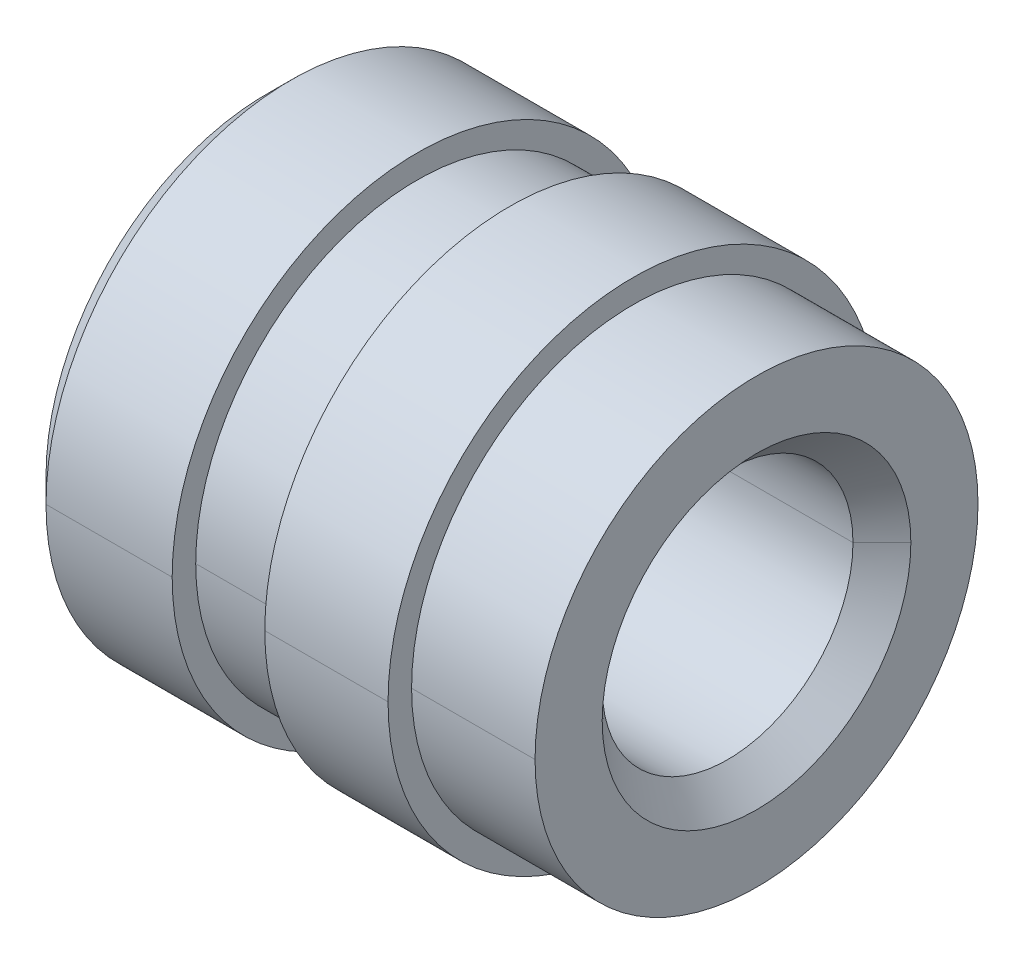
ISO-10303-21;
HEADER;
FILE_DESCRIPTION(('STEP AP214'),'2;1');
FILE_NAME('part.step','',(''),(''),'','','');
FILE_SCHEMA(('AUTOMOTIVE_DESIGN { 1 0 10303 214 1 1 1 1 }'));
ENDSEC;
DATA;
#1=APPLICATION_CONTEXT('core data for automotive mechanical design processes');
#2=APPLICATION_PROTOCOL_DEFINITION('international standard','automotive_design',2000,#1);
#3=PRODUCT_CONTEXT('',#1,'mechanical');
#4=PRODUCT('Part','Part','',(#3));
#5=PRODUCT_RELATED_PRODUCT_CATEGORY('part','',(#4));
#6=PRODUCT_DEFINITION_FORMATION('','',#4);
#7=PRODUCT_DEFINITION_CONTEXT('part definition',#1,'design');
#8=PRODUCT_DEFINITION('design','',#6,#7);
#9=PRODUCT_DEFINITION_SHAPE('','',#8);
#10=(LENGTH_UNIT() NAMED_UNIT(*) SI_UNIT(.MILLI.,.METRE.));
#11=(NAMED_UNIT(*) PLANE_ANGLE_UNIT() SI_UNIT($,.RADIAN.));
#12=(NAMED_UNIT(*) SI_UNIT($,.STERADIAN.) SOLID_ANGLE_UNIT());
#13=UNCERTAINTY_MEASURE_WITH_UNIT(LENGTH_MEASURE(1.E-05),#10,'distance_accuracy_value','');
#14=(GEOMETRIC_REPRESENTATION_CONTEXT(3) GLOBAL_UNCERTAINTY_ASSIGNED_CONTEXT((#13)) GLOBAL_UNIT_ASSIGNED_CONTEXT((#10,
#11,#12)) REPRESENTATION_CONTEXT('',''));
#15=CARTESIAN_POINT('',(0.,0.,0.));
#16=DIRECTION('',(0.,0.,1.));
#17=DIRECTION('',(1.,0.,0.));
#18=AXIS2_PLACEMENT_3D('',#15,#16,#17);
#19=CARTESIAN_POINT('',(-0.8,0.,0.));
#20=DIRECTION('',(1.,0.,0.));
#21=DIRECTION('',(0.,1.10623880200757E-13,1.));
#22=AXIS2_PLACEMENT_3D('',#19,#20,#21);
#23=CYLINDRICAL_SURFACE('',#22,2.87);
#24=DIRECTION('',(1.,0.,0.));
#25=VECTOR('',#24,1.);
#26=CARTESIAN_POINT('',(-0.8,3.17841998199719E-13,2.87));
#27=LINE('',#26,#25);
#28=CARTESIAN_POINT('',(-1.6,0.,2.87));
#29=VERTEX_POINT('',#28);
#30=CARTESIAN_POINT('',(0.,0.,2.87));
#31=VERTEX_POINT('',#30);
#32=EDGE_CURVE('E27',#29,#31,#27,.T.);
#33=ORIENTED_EDGE('',*,*,#32,.F.);
#34=CARTESIAN_POINT('',(-1.6,0.,0.));
#35=DIRECTION('',(1.,0.,0.));
#36=DIRECTION('',(0.,1.10623880200757E-13,1.));
#37=AXIS2_PLACEMENT_3D('',#34,#35,#36);
#38=CIRCLE('',#37,2.87);
#39=CARTESIAN_POINT('',(-1.6,-3.17841998199719E-13,-2.87));
#40=VERTEX_POINT('',#39);
#41=EDGE_CURVE('E259',#29,#40,#38,.T.);
#42=ORIENTED_EDGE('',*,*,#41,.T.);
#43=DIRECTION('',(-1.,0.,0.));
#44=VECTOR('',#43,1.);
#45=CARTESIAN_POINT('',(-0.8,-3.17841998199719E-13,-2.87));
#46=LINE('',#45,#44);
#47=CARTESIAN_POINT('',(0.,-3.17841998199719E-13,-2.87));
#48=VERTEX_POINT('',#47);
#49=EDGE_CURVE('E11',#48,#40,#46,.T.);
#50=ORIENTED_EDGE('',*,*,#49,.F.);
#51=CARTESIAN_POINT('',(0.,0.,0.));
#52=DIRECTION('',(1.,0.,0.));
#53=DIRECTION('',(0.,1.10623880200757E-13,1.));
#54=AXIS2_PLACEMENT_3D('',#51,#52,#53);
#55=CIRCLE('',#54,2.87);
#56=EDGE_CURVE('E215',#31,#48,#55,.T.);
#57=ORIENTED_EDGE('',*,*,#56,.F.);
#58=EDGE_LOOP('',(#33,#42,#50,#57));
#59=FACE_BOUND('',#58,.T.);
#60=ADVANCED_FACE('F16',(#59),#23,.T.);
#61=CARTESIAN_POINT('',(-0.8,0.,0.));
#62=DIRECTION('',(1.,0.,0.));
#63=DIRECTION('',(0.,1.10623880200757E-13,1.));
#64=AXIS2_PLACEMENT_3D('',#61,#62,#63);
#65=CYLINDRICAL_SURFACE('',#64,2.87);
#66=ORIENTED_EDGE('',*,*,#32,.T.);
#67=CARTESIAN_POINT('',(0.,0.,0.));
#68=DIRECTION('',(1.,0.,0.));
#69=DIRECTION('',(0.,1.10623880200757E-13,1.));
#70=AXIS2_PLACEMENT_3D('',#67,#68,#69);
#71=CIRCLE('',#70,2.87);
#72=EDGE_CURVE('E263',#48,#31,#71,.T.);
#73=ORIENTED_EDGE('',*,*,#72,.F.);
#74=ORIENTED_EDGE('',*,*,#49,.T.);
#75=CARTESIAN_POINT('',(-1.6,0.,0.));
#76=DIRECTION('',(1.,0.,0.));
#77=DIRECTION('',(0.,1.10623880200757E-13,1.));
#78=AXIS2_PLACEMENT_3D('',#75,#76,#77);
#79=CIRCLE('',#78,2.87);
#80=EDGE_CURVE('E258',#40,#29,#79,.T.);
#81=ORIENTED_EDGE('',*,*,#80,.T.);
#82=EDGE_LOOP('',(#66,#73,#74,#81));
#83=FACE_BOUND('',#82,.T.);
#84=ADVANCED_FACE('F637',(#83),#65,.T.);
#85=CARTESIAN_POINT('',(-1.6,0.,3.0225));
#86=DIRECTION('',(1.,0.,0.));
#87=DIRECTION('',(0.,0.,1.));
#88=AXIS2_PLACEMENT_3D('',#85,#86,#87);
#89=PLANE('',#88);
#90=CARTESIAN_POINT('',(-1.6,0.,0.));
#91=DIRECTION('',(1.,0.,0.));
#92=DIRECTION('',(0.,1.10623880200757E-13,1.));
#93=AXIS2_PLACEMENT_3D('',#90,#91,#92);
#94=CIRCLE('',#93,3.175);
#95=CARTESIAN_POINT('',(-1.6,0.,3.175));
#96=VERTEX_POINT('',#95);
#97=CARTESIAN_POINT('',(-1.6,-3.51619632154741E-13,-3.175));
#98=VERTEX_POINT('',#97);
#99=EDGE_CURVE('E212',#96,#98,#94,.T.);
#100=ORIENTED_EDGE('',*,*,#99,.T.);
#101=CARTESIAN_POINT('',(-1.6,0.,0.));
#102=DIRECTION('',(1.,0.,0.));
#103=DIRECTION('',(0.,1.10623880200757E-13,1.));
#104=AXIS2_PLACEMENT_3D('',#101,#102,#103);
#105=CIRCLE('',#104,3.175);
#106=EDGE_CURVE('E211',#98,#96,#105,.T.);
#107=ORIENTED_EDGE('',*,*,#106,.T.);
#108=EDGE_LOOP('',(#100,#107));
#109=FACE_BOUND('',#108,.T.);
#110=ORIENTED_EDGE('',*,*,#41,.F.);
#111=ORIENTED_EDGE('',*,*,#80,.F.);
#112=EDGE_LOOP('',(#110,#111));
#113=FACE_BOUND('',#112,.T.);
#114=ADVANCED_FACE('F571',(#109,#113),#89,.T.);
#115=CARTESIAN_POINT('',(0.,0.,1.435));
#116=DIRECTION('',(1.,0.,0.));
#117=DIRECTION('',(0.,0.,1.));
#118=AXIS2_PLACEMENT_3D('',#115,#116,#117);
#119=PLANE('',#118);
#120=ORIENTED_EDGE('',*,*,#56,.T.);
#121=ORIENTED_EDGE('',*,*,#72,.T.);
#122=EDGE_LOOP('',(#120,#121));
#123=FACE_BOUND('',#122,.T.);
#124=CARTESIAN_POINT('',(0.,0.,0.));
#125=DIRECTION('',(-1.,0.,0.));
#126=DIRECTION('',(0.,0.,1.));
#127=AXIS2_PLACEMENT_3D('',#124,#125,#126);
#128=CIRCLE('',#127,2.);
#129=CARTESIAN_POINT('',(0.,0.,2.));
#130=VERTEX_POINT('',#129);
#131=CARTESIAN_POINT('',(0.,0.,-2.));
#132=VERTEX_POINT('',#131);
#133=EDGE_CURVE('E152',#130,#132,#128,.T.);
#134=ORIENTED_EDGE('',*,*,#133,.T.);
#135=CARTESIAN_POINT('',(0.,0.,0.));
#136=DIRECTION('',(-1.,0.,0.));
#137=DIRECTION('',(0.,0.,1.));
#138=AXIS2_PLACEMENT_3D('',#135,#136,#137);
#139=CIRCLE('',#138,2.);
#140=EDGE_CURVE('E165',#132,#130,#139,.T.);
#141=ORIENTED_EDGE('',*,*,#140,.T.);
#142=EDGE_LOOP('',(#134,#141));
#143=FACE_BOUND('',#142,.T.);
#144=ADVANCED_FACE('F166',(#123,#143),#119,.T.);
#145=CARTESIAN_POINT('',(-2.39875,0.,0.));
#146=DIRECTION('',(1.,0.,0.));
#147=DIRECTION('',(0.,1.10623880200757E-13,1.));
#148=AXIS2_PLACEMENT_3D('',#145,#146,#147);
#149=CYLINDRICAL_SURFACE('',#148,3.175);
#150=DIRECTION('',(1.,0.,0.));
#151=VECTOR('',#150,1.);
#152=CARTESIAN_POINT('',(-2.39875,3.51619632154741E-13,3.175));
#153=LINE('',#152,#151);
#154=CARTESIAN_POINT('',(-3.1975,0.,3.175));
#155=VERTEX_POINT('',#154);
#156=EDGE_CURVE('E163',#155,#96,#153,.T.);
#157=ORIENTED_EDGE('',*,*,#156,.F.);
#158=CARTESIAN_POINT('',(-3.1975,0.,0.));
#159=DIRECTION('',(1.,0.,0.));
#160=DIRECTION('',(0.,1.10623880200757E-13,1.));
#161=AXIS2_PLACEMENT_3D('',#158,#159,#160);
#162=CIRCLE('',#161,3.175);
#163=CARTESIAN_POINT('',(-3.1975,-3.51619632154741E-13,-3.175));
#164=VERTEX_POINT('',#163);
#165=EDGE_CURVE('E183',#155,#164,#162,.T.);
#166=ORIENTED_EDGE('',*,*,#165,.T.);
#167=DIRECTION('',(-1.,0.,0.));
#168=VECTOR('',#167,1.);
#169=CARTESIAN_POINT('',(-2.39875,-3.51619632154741E-13,-3.175));
#170=LINE('',#169,#168);
#171=EDGE_CURVE('E216',#98,#164,#170,.T.);
#172=ORIENTED_EDGE('',*,*,#171,.F.);
#173=ORIENTED_EDGE('',*,*,#99,.F.);
#174=EDGE_LOOP('',(#157,#166,#172,#173));
#175=FACE_BOUND('',#174,.T.);
#176=ADVANCED_FACE('F570',(#175),#149,.T.);
#177=CARTESIAN_POINT('',(-2.39875,0.,0.));
#178=DIRECTION('',(1.,0.,0.));
#179=DIRECTION('',(0.,1.10623880200757E-13,1.));
#180=AXIS2_PLACEMENT_3D('',#177,#178,#179);
#181=CYLINDRICAL_SURFACE('',#180,3.175);
#182=ORIENTED_EDGE('',*,*,#156,.T.);
#183=ORIENTED_EDGE('',*,*,#106,.F.);
#184=ORIENTED_EDGE('',*,*,#171,.T.);
#185=CARTESIAN_POINT('',(-3.1975,0.,0.));
#186=DIRECTION('',(1.,0.,0.));
#187=DIRECTION('',(0.,1.10623880200757E-13,1.));
#188=AXIS2_PLACEMENT_3D('',#185,#186,#187);
#189=CIRCLE('',#188,3.175);
#190=EDGE_CURVE('E176',#164,#155,#189,.T.);
#191=ORIENTED_EDGE('',*,*,#190,.T.);
#192=EDGE_LOOP('',(#182,#183,#184,#191));
#193=FACE_BOUND('',#192,.T.);
#194=ADVANCED_FACE('F18',(#193),#181,.T.);
#195=CARTESIAN_POINT('',(-0.1875,0.,0.));
#196=DIRECTION('',(1.,0.,0.));
#197=DIRECTION('',(0.,0.,1.));
#198=AXIS2_PLACEMENT_3D('',#195,#196,#197);
#199=CONICAL_SURFACE('',#198,1.8125,0.785398163397448);
#200=DIRECTION('',(0.707106781186547,0.,0.707106781186548));
#201=VECTOR('',#200,1.);
#202=CARTESIAN_POINT('',(-0.1875,0.,1.8125));
#203=LINE('',#202,#201);
#204=CARTESIAN_POINT('',(-0.375,0.,1.625));
#205=VERTEX_POINT('',#204);
#206=EDGE_CURVE('E157',#205,#130,#203,.T.);
#207=ORIENTED_EDGE('',*,*,#206,.F.);
#208=CARTESIAN_POINT('',(-0.375,0.,0.));
#209=DIRECTION('',(1.,0.,0.));
#210=DIRECTION('',(0.,0.,1.));
#211=AXIS2_PLACEMENT_3D('',#208,#209,#210);
#212=CIRCLE('',#211,1.625);
#213=CARTESIAN_POINT('',(-0.375,0.,-1.625));
#214=VERTEX_POINT('',#213);
#215=EDGE_CURVE('E274',#214,#205,#212,.T.);
#216=ORIENTED_EDGE('',*,*,#215,.F.);
#217=DIRECTION('',(-0.707106781186548,0.,0.707106781186547));
#218=VECTOR('',#217,1.);
#219=CARTESIAN_POINT('',(-0.1875,0.,-1.8125));
#220=LINE('',#219,#218);
#221=EDGE_CURVE('E159',#132,#214,#220,.T.);
#222=ORIENTED_EDGE('',*,*,#221,.F.);
#223=ORIENTED_EDGE('',*,*,#133,.F.);
#224=EDGE_LOOP('',(#207,#216,#222,#223));
#225=FACE_BOUND('',#224,.T.);
#226=ADVANCED_FACE('F154',(#225),#199,.F.);
#227=CARTESIAN_POINT('',(-0.1875,0.,0.));
#228=DIRECTION('',(1.,0.,0.));
#229=DIRECTION('',(0.,0.,1.));
#230=AXIS2_PLACEMENT_3D('',#227,#228,#229);
#231=CONICAL_SURFACE('',#230,1.8125,0.785398163397448);
#232=ORIENTED_EDGE('',*,*,#206,.T.);
#233=ORIENTED_EDGE('',*,*,#140,.F.);
#234=ORIENTED_EDGE('',*,*,#221,.T.);
#235=CARTESIAN_POINT('',(-0.375,0.,0.));
#236=DIRECTION('',(1.,0.,0.));
#237=DIRECTION('',(0.,0.,1.));
#238=AXIS2_PLACEMENT_3D('',#235,#236,#237);
#239=CIRCLE('',#238,1.625);
#240=EDGE_CURVE('E173',#205,#214,#239,.T.);
#241=ORIENTED_EDGE('',*,*,#240,.F.);
#242=EDGE_LOOP('',(#232,#233,#234,#241));
#243=FACE_BOUND('',#242,.T.);
#244=ADVANCED_FACE('F171',(#243),#231,.F.);
#245=CARTESIAN_POINT('',(-3.1975,0.,3.0225));
#246=DIRECTION('',(-1.,0.,0.));
#247=DIRECTION('',(0.,0.,1.));
#248=AXIS2_PLACEMENT_3D('',#245,#246,#247);
#249=PLANE('',#248);
#250=CARTESIAN_POINT('',(-3.1975,0.,0.));
#251=DIRECTION('',(1.,0.,0.));
#252=DIRECTION('',(0.,1.10623880200757E-13,1.));
#253=AXIS2_PLACEMENT_3D('',#250,#251,#252);
#254=CIRCLE('',#253,2.87);
#255=CARTESIAN_POINT('',(-3.1975,0.,2.87));
#256=VERTEX_POINT('',#255);
#257=CARTESIAN_POINT('',(-3.1975,-3.17841998199719E-13,-2.87));
#258=VERTEX_POINT('',#257);
#259=EDGE_CURVE('E250',#256,#258,#254,.T.);
#260=ORIENTED_EDGE('',*,*,#259,.T.);
#261=CARTESIAN_POINT('',(-3.1975,0.,0.));
#262=DIRECTION('',(1.,0.,0.));
#263=DIRECTION('',(0.,1.10623880200757E-13,1.));
#264=AXIS2_PLACEMENT_3D('',#261,#262,#263);
#265=CIRCLE('',#264,2.87);
#266=EDGE_CURVE('E202',#258,#256,#265,.T.);
#267=ORIENTED_EDGE('',*,*,#266,.T.);
#268=EDGE_LOOP('',(#260,#267));
#269=FACE_BOUND('',#268,.T.);
#270=ORIENTED_EDGE('',*,*,#165,.F.);
#271=ORIENTED_EDGE('',*,*,#190,.F.);
#272=EDGE_LOOP('',(#270,#271));
#273=FACE_BOUND('',#272,.T.);
#274=ADVANCED_FACE('F435',(#269,#273),#249,.T.);
#275=CARTESIAN_POINT('',(-1.7275,0.,0.));
#276=DIRECTION('',(1.,0.,0.));
#277=DIRECTION('',(0.,0.,1.));
#278=AXIS2_PLACEMENT_3D('',#275,#276,#277);
#279=CYLINDRICAL_SURFACE('',#278,1.625);
#280=DIRECTION('',(1.,0.,0.));
#281=VECTOR('',#280,1.);
#282=CARTESIAN_POINT('',(-1.7275,0.,1.625));
#283=LINE('',#282,#281);
#284=CARTESIAN_POINT('',(-3.08,0.,1.625));
#285=VERTEX_POINT('',#284);
#286=EDGE_CURVE('E236',#285,#205,#283,.T.);
#287=ORIENTED_EDGE('',*,*,#286,.F.);
#288=CARTESIAN_POINT('',(-3.08,0.,0.));
#289=DIRECTION('',(1.,0.,0.));
#290=DIRECTION('',(0.,0.,1.));
#291=AXIS2_PLACEMENT_3D('',#288,#289,#290);
#292=CIRCLE('',#291,1.625);
#293=CARTESIAN_POINT('',(-3.08,0.,-1.625));
#294=VERTEX_POINT('',#293);
#295=EDGE_CURVE('E203',#294,#285,#292,.T.);
#296=ORIENTED_EDGE('',*,*,#295,.F.);
#297=DIRECTION('',(-1.,0.,0.));
#298=VECTOR('',#297,1.);
#299=CARTESIAN_POINT('',(-1.7275,0.,-1.625));
#300=LINE('',#299,#298);
#301=EDGE_CURVE('E235',#214,#294,#300,.T.);
#302=ORIENTED_EDGE('',*,*,#301,.F.);
#303=ORIENTED_EDGE('',*,*,#215,.T.);
#304=EDGE_LOOP('',(#287,#296,#302,#303));
#305=FACE_BOUND('',#304,.T.);
#306=ADVANCED_FACE('F443',(#305),#279,.F.);
#307=CARTESIAN_POINT('',(-1.7275,0.,0.));
#308=DIRECTION('',(1.,0.,0.));
#309=DIRECTION('',(0.,0.,1.));
#310=AXIS2_PLACEMENT_3D('',#307,#308,#309);
#311=CYLINDRICAL_SURFACE('',#310,1.625);
#312=ORIENTED_EDGE('',*,*,#286,.T.);
#313=ORIENTED_EDGE('',*,*,#240,.T.);
#314=ORIENTED_EDGE('',*,*,#301,.T.);
#315=CARTESIAN_POINT('',(-3.08,0.,0.));
#316=DIRECTION('',(1.,0.,0.));
#317=DIRECTION('',(0.,0.,1.));
#318=AXIS2_PLACEMENT_3D('',#315,#316,#317);
#319=CIRCLE('',#318,1.625);
#320=EDGE_CURVE('E225',#285,#294,#319,.T.);
#321=ORIENTED_EDGE('',*,*,#320,.F.);
#322=EDGE_LOOP('',(#312,#313,#314,#321));
#323=FACE_BOUND('',#322,.T.);
#324=ADVANCED_FACE('F448',(#323),#311,.F.);
#325=CARTESIAN_POINT('',(-3.7975,0.,0.));
#326=DIRECTION('',(1.,0.,0.));
#327=DIRECTION('',(0.,1.10623880200757E-13,1.));
#328=AXIS2_PLACEMENT_3D('',#325,#326,#327);
#329=CYLINDRICAL_SURFACE('',#328,2.87);
#330=DIRECTION('',(1.,0.,0.));
#331=VECTOR('',#330,1.);
#332=CARTESIAN_POINT('',(-3.7975,3.17841998199719E-13,2.87));
#333=LINE('',#332,#331);
#334=CARTESIAN_POINT('',(-4.3975,0.,2.87));
#335=VERTEX_POINT('',#334);
#336=EDGE_CURVE('E198',#335,#256,#333,.T.);
#337=ORIENTED_EDGE('',*,*,#336,.F.);
#338=CARTESIAN_POINT('',(-4.3975,0.,0.));
#339=DIRECTION('',(1.,0.,0.));
#340=DIRECTION('',(0.,1.10623880200757E-13,1.));
#341=AXIS2_PLACEMENT_3D('',#338,#339,#340);
#342=CIRCLE('',#341,2.87);
#343=CARTESIAN_POINT('',(-4.3975,-3.17841998199719E-13,-2.87));
#344=VERTEX_POINT('',#343);
#345=EDGE_CURVE('E264',#335,#344,#342,.T.);
#346=ORIENTED_EDGE('',*,*,#345,.T.);
#347=DIRECTION('',(-1.,0.,0.));
#348=VECTOR('',#347,1.);
#349=CARTESIAN_POINT('',(-3.7975,-3.17841998199719E-13,-2.87));
#350=LINE('',#349,#348);
#351=EDGE_CURVE('E207',#258,#344,#350,.T.);
#352=ORIENTED_EDGE('',*,*,#351,.F.);
#353=ORIENTED_EDGE('',*,*,#259,.F.);
#354=EDGE_LOOP('',(#337,#346,#352,#353));
#355=FACE_BOUND('',#354,.T.);
#356=ADVANCED_FACE('F459',(#355),#329,.T.);
#357=CARTESIAN_POINT('',(-3.7975,0.,0.));
#358=DIRECTION('',(1.,0.,0.));
#359=DIRECTION('',(0.,1.10623880200757E-13,1.));
#360=AXIS2_PLACEMENT_3D('',#357,#358,#359);
#361=CYLINDRICAL_SURFACE('',#360,2.87);
#362=ORIENTED_EDGE('',*,*,#336,.T.);
#363=ORIENTED_EDGE('',*,*,#266,.F.);
#364=ORIENTED_EDGE('',*,*,#351,.T.);
#365=CARTESIAN_POINT('',(-4.3975,0.,0.));
#366=DIRECTION('',(1.,0.,0.));
#367=DIRECTION('',(0.,1.10623880200757E-13,1.));
#368=AXIS2_PLACEMENT_3D('',#365,#366,#367);
#369=CIRCLE('',#368,2.87);
#370=EDGE_CURVE('E229',#344,#335,#369,.T.);
#371=ORIENTED_EDGE('',*,*,#370,.T.);
#372=EDGE_LOOP('',(#362,#363,#364,#371));
#373=FACE_BOUND('',#372,.T.);
#374=ADVANCED_FACE('F474',(#373),#361,.T.);
#375=CARTESIAN_POINT('',(-3.08,0.,1.8125));
#376=DIRECTION('',(-1.,0.,0.));
#377=DIRECTION('',(0.,0.,1.));
#378=AXIS2_PLACEMENT_3D('',#375,#376,#377);
#379=PLANE('',#378);
#380=CARTESIAN_POINT('',(-3.08,0.,0.));
#381=DIRECTION('',(1.,0.,0.));
#382=DIRECTION('',(0.,0.,1.));
#383=AXIS2_PLACEMENT_3D('',#380,#381,#382);
#384=CIRCLE('',#383,1.63);
#385=CARTESIAN_POINT('',(-3.08,0.,1.63));
#386=VERTEX_POINT('',#385);
#387=CARTESIAN_POINT('',(-3.08,0.,-1.63));
#388=VERTEX_POINT('',#387);
#389=EDGE_CURVE('E20',#386,#388,#384,.T.);
#390=ORIENTED_EDGE('',*,*,#389,.F.);
#391=CARTESIAN_POINT('',(-3.08,0.,0.));
#392=DIRECTION('',(1.,0.,0.));
#393=DIRECTION('',(0.,0.,1.));
#394=AXIS2_PLACEMENT_3D('',#391,#392,#393);
#395=CIRCLE('',#394,1.63);
#396=EDGE_CURVE('E241',#388,#386,#395,.T.);
#397=ORIENTED_EDGE('',*,*,#396,.F.);
#398=EDGE_LOOP('',(#390,#397));
#399=FACE_BOUND('',#398,.T.);
#400=ORIENTED_EDGE('',*,*,#320,.T.);
#401=ORIENTED_EDGE('',*,*,#295,.T.);
#402=EDGE_LOOP('',(#400,#401));
#403=FACE_BOUND('',#402,.T.);
#404=ADVANCED_FACE('F468',(#399,#403),#379,.T.);
#405=CARTESIAN_POINT('',(-4.3975,0.,3.0225));
#406=DIRECTION('',(1.,0.,0.));
#407=DIRECTION('',(0.,0.,1.));
#408=AXIS2_PLACEMENT_3D('',#405,#406,#407);
#409=PLANE('',#408);
#410=CARTESIAN_POINT('',(-4.3975,0.,0.));
#411=DIRECTION('',(1.,0.,0.));
#412=DIRECTION('',(0.,1.10623880200757E-13,1.));
#413=AXIS2_PLACEMENT_3D('',#410,#411,#412);
#414=CIRCLE('',#413,3.175);
#415=CARTESIAN_POINT('',(-4.3975,0.,3.175));
#416=VERTEX_POINT('',#415);
#417=CARTESIAN_POINT('',(-4.3975,-3.51619632154741E-13,-3.175));
#418=VERTEX_POINT('',#417);
#419=EDGE_CURVE('E118',#416,#418,#414,.T.);
#420=ORIENTED_EDGE('',*,*,#419,.T.);
#421=CARTESIAN_POINT('',(-4.3975,0.,0.));
#422=DIRECTION('',(1.,0.,0.));
#423=DIRECTION('',(0.,1.10623880200757E-13,1.));
#424=AXIS2_PLACEMENT_3D('',#421,#422,#423);
#425=CIRCLE('',#424,3.175);
#426=EDGE_CURVE('E192',#418,#416,#425,.T.);
#427=ORIENTED_EDGE('',*,*,#426,.T.);
#428=EDGE_LOOP('',(#420,#427));
#429=FACE_BOUND('',#428,.T.);
#430=ORIENTED_EDGE('',*,*,#345,.F.);
#431=ORIENTED_EDGE('',*,*,#370,.F.);
#432=EDGE_LOOP('',(#430,#431));
#433=FACE_BOUND('',#432,.T.);
#434=ADVANCED_FACE('F473',(#429,#433),#409,.T.);
#435=CARTESIAN_POINT('',(-3.95442717971257,0.,0.));
#436=DIRECTION('',(1.,0.,0.));
#437=DIRECTION('',(0.,0.,1.));
#438=AXIS2_PLACEMENT_3D('',#435,#436,#437);
#439=CYLINDRICAL_SURFACE('',#438,1.63);
#440=DIRECTION('',(-1.,0.,0.));
#441=VECTOR('',#440,1.);
#442=CARTESIAN_POINT('',(-3.95442717971257,0.,1.63));
#443=LINE('',#442,#441);
#444=CARTESIAN_POINT('',(-4.82885435942514,0.,1.63));
#445=VERTEX_POINT('',#444);
#446=EDGE_CURVE('E242',#386,#445,#443,.T.);
#447=ORIENTED_EDGE('',*,*,#446,.F.);
#448=ORIENTED_EDGE('',*,*,#389,.T.);
#449=DIRECTION('',(1.,0.,0.));
#450=VECTOR('',#449,1.);
#451=CARTESIAN_POINT('',(-3.95442717971257,0.,-1.63));
#452=LINE('',#451,#450);
#453=CARTESIAN_POINT('',(-4.82885435942514,0.,-1.63));
#454=VERTEX_POINT('',#453);
#455=EDGE_CURVE('E237',#454,#388,#452,.T.);
#456=ORIENTED_EDGE('',*,*,#455,.F.);
#457=CARTESIAN_POINT('',(-4.82885435942514,0.,0.));
#458=DIRECTION('',(1.,0.,0.));
#459=DIRECTION('',(0.,0.,1.));
#460=AXIS2_PLACEMENT_3D('',#457,#458,#459);
#461=CIRCLE('',#460,1.63);
#462=EDGE_CURVE('E284',#445,#454,#461,.T.);
#463=ORIENTED_EDGE('',*,*,#462,.F.);
#464=EDGE_LOOP('',(#447,#448,#456,#463));
#465=FACE_BOUND('',#464,.T.);
#466=ADVANCED_FACE('F484',(#465),#439,.F.);
#467=CARTESIAN_POINT('',(-3.95442717971257,0.,0.));
#468=DIRECTION('',(1.,0.,0.));
#469=DIRECTION('',(0.,0.,1.));
#470=AXIS2_PLACEMENT_3D('',#467,#468,#469);
#471=CYLINDRICAL_SURFACE('',#470,1.63);
#472=ORIENTED_EDGE('',*,*,#446,.T.);
#473=CARTESIAN_POINT('',(-4.82885435942514,0.,0.));
#474=DIRECTION('',(1.,0.,0.));
#475=DIRECTION('',(0.,0.,1.));
#476=AXIS2_PLACEMENT_3D('',#473,#474,#475);
#477=CIRCLE('',#476,1.63);
#478=EDGE_CURVE('E193',#454,#445,#477,.T.);
#479=ORIENTED_EDGE('',*,*,#478,.F.);
#480=ORIENTED_EDGE('',*,*,#455,.T.);
#481=ORIENTED_EDGE('',*,*,#396,.T.);
#482=EDGE_LOOP('',(#472,#479,#480,#481));
#483=FACE_BOUND('',#482,.T.);
#484=ADVANCED_FACE('F489',(#483),#471,.F.);
#485=CARTESIAN_POINT('',(-5.215,0.,0.));
#486=DIRECTION('',(1.,0.,0.));
#487=DIRECTION('',(0.,1.10623880200757E-13,1.));
#488=AXIS2_PLACEMENT_3D('',#485,#486,#487);
#489=CYLINDRICAL_SURFACE('',#488,3.175);
#490=DIRECTION('',(1.,0.,0.));
#491=VECTOR('',#490,1.);
#492=CARTESIAN_POINT('',(-5.215,3.51619632154741E-13,3.175));
#493=LINE('',#492,#491);
#494=CARTESIAN_POINT('',(-6.0325,0.,3.175));
#495=VERTEX_POINT('',#494);
#496=EDGE_CURVE('E285',#495,#416,#493,.T.);
#497=ORIENTED_EDGE('',*,*,#496,.F.);
#498=CARTESIAN_POINT('',(-6.0325,0.,0.));
#499=DIRECTION('',(1.,0.,0.));
#500=DIRECTION('',(0.,1.10623880200757E-13,1.));
#501=AXIS2_PLACEMENT_3D('',#498,#499,#500);
#502=CIRCLE('',#501,3.175);
#503=CARTESIAN_POINT('',(-6.0325,-3.51619632154741E-13,-3.175));
#504=VERTEX_POINT('',#503);
#505=EDGE_CURVE('E220',#495,#504,#502,.T.);
#506=ORIENTED_EDGE('',*,*,#505,.T.);
#507=DIRECTION('',(-1.,0.,0.));
#508=VECTOR('',#507,1.);
#509=CARTESIAN_POINT('',(-5.215,-3.51619632154741E-13,-3.175));
#510=LINE('',#509,#508);
#511=EDGE_CURVE('E189',#418,#504,#510,.T.);
#512=ORIENTED_EDGE('',*,*,#511,.F.);
#513=ORIENTED_EDGE('',*,*,#419,.F.);
#514=EDGE_LOOP('',(#497,#506,#512,#513));
#515=FACE_BOUND('',#514,.T.);
#516=ADVANCED_FACE('F500',(#515),#489,.T.);
#517=CARTESIAN_POINT('',(-5.215,0.,0.));
#518=DIRECTION('',(1.,0.,0.));
#519=DIRECTION('',(0.,1.10623880200757E-13,1.));
#520=AXIS2_PLACEMENT_3D('',#517,#518,#519);
#521=CYLINDRICAL_SURFACE('',#520,3.175);
#522=ORIENTED_EDGE('',*,*,#496,.T.);
#523=ORIENTED_EDGE('',*,*,#426,.F.);
#524=ORIENTED_EDGE('',*,*,#511,.T.);
#525=CARTESIAN_POINT('',(-6.0325,0.,0.));
#526=DIRECTION('',(1.,0.,0.));
#527=DIRECTION('',(0.,1.10623880200757E-13,1.));
#528=AXIS2_PLACEMENT_3D('',#525,#526,#527);
#529=CIRCLE('',#528,3.175);
#530=EDGE_CURVE('E221',#504,#495,#529,.T.);
#531=ORIENTED_EDGE('',*,*,#530,.T.);
#532=EDGE_LOOP('',(#522,#523,#524,#531));
#533=FACE_BOUND('',#532,.T.);
#534=ADVANCED_FACE('F514',(#533),#521,.T.);
#535=CARTESIAN_POINT('',(-5.29939482881469,0.,0.));
#536=DIRECTION('',(1.,0.,0.));
#537=DIRECTION('',(0.,0.,1.));
#538=AXIS2_PLACEMENT_3D('',#535,#536,#537);
#539=CONICAL_SURFACE('',#538,0.815,1.0471975511966);
#540=DIRECTION('',(0.5,0.,-0.866025403784439));
#541=VECTOR('',#540,1.);
#542=CARTESIAN_POINT('',(-5.29939482881469,0.,-0.815));
#543=LINE('',#542,#541);
#544=CARTESIAN_POINT('',(-5.76993529820423,0.,0.));
#545=VERTEX_POINT('',#544);
#546=EDGE_CURVE('E187',#545,#454,#543,.T.);
#547=ORIENTED_EDGE('',*,*,#546,.F.);
#548=DIRECTION('',(-0.5,0.,-0.866025403784439));
#549=VECTOR('',#548,1.);
#550=CARTESIAN_POINT('',(-5.29939482881469,0.,0.815));
#551=LINE('',#550,#549);
#552=EDGE_CURVE('E197',#445,#545,#551,.T.);
#553=ORIENTED_EDGE('',*,*,#552,.F.);
#554=ORIENTED_EDGE('',*,*,#462,.T.);
#555=EDGE_LOOP('',(#547,#553,#554));
#556=FACE_BOUND('',#555,.T.);
#557=ADVANCED_FACE('F508',(#556),#539,.F.);
#558=CARTESIAN_POINT('',(-5.29939482881469,0.,0.));
#559=DIRECTION('',(1.,0.,0.));
#560=DIRECTION('',(0.,0.,1.));
#561=AXIS2_PLACEMENT_3D('',#558,#559,#560);
#562=CONICAL_SURFACE('',#561,0.815,1.0471975511966);
#563=ORIENTED_EDGE('',*,*,#546,.T.);
#564=ORIENTED_EDGE('',*,*,#478,.T.);
#565=ORIENTED_EDGE('',*,*,#552,.T.);
#566=EDGE_LOOP('',(#563,#564,#565));
#567=FACE_BOUND('',#566,.T.);
#568=ADVANCED_FACE('F513',(#567),#562,.F.);
#569=CARTESIAN_POINT('',(-6.19125,0.,0.));
#570=DIRECTION('',(1.,0.,0.));
#571=DIRECTION('',(0.,1.10623880200757E-13,1.));
#572=AXIS2_PLACEMENT_3D('',#569,#570,#571);
#573=CONICAL_SURFACE('',#572,3.01625,0.785398163397448);
#574=DIRECTION('',(0.707106781186547,0.,0.707106781186548));
#575=VECTOR('',#574,1.);
#576=CARTESIAN_POINT('',(-6.19125,3.34038650547004E-13,3.01625));
#577=LINE('',#576,#575);
#578=CARTESIAN_POINT('',(-6.35,0.,2.8575));
#579=VERTEX_POINT('',#578);
#580=EDGE_CURVE('E243',#579,#495,#577,.T.);
#581=ORIENTED_EDGE('',*,*,#580,.F.);
#582=CARTESIAN_POINT('',(-6.35,0.,0.));
#583=DIRECTION('',(1.,0.,0.));
#584=DIRECTION('',(0.,1.10623880200757E-13,1.));
#585=AXIS2_PLACEMENT_3D('',#582,#583,#584);
#586=CIRCLE('',#585,2.8575);
#587=CARTESIAN_POINT('',(-6.35,-3.16457668939267E-13,-2.8575));
#588=VERTEX_POINT('',#587);
#589=EDGE_CURVE('E251',#579,#588,#586,.T.);
#590=ORIENTED_EDGE('',*,*,#589,.T.);
#591=DIRECTION('',(-0.707106781186548,0.,0.707106781186547));
#592=VECTOR('',#591,1.);
#593=CARTESIAN_POINT('',(-6.19125,-3.34038650547004E-13,-3.01625));
#594=LINE('',#593,#592);
#595=EDGE_CURVE('E217',#504,#588,#594,.T.);
#596=ORIENTED_EDGE('',*,*,#595,.F.);
#597=ORIENTED_EDGE('',*,*,#505,.F.);
#598=EDGE_LOOP('',(#581,#590,#596,#597));
#599=FACE_BOUND('',#598,.T.);
#600=ADVANCED_FACE('F322',(#599),#573,.T.);
#601=CARTESIAN_POINT('',(-6.19125,0.,0.));
#602=DIRECTION('',(1.,0.,0.));
#603=DIRECTION('',(0.,1.10623880200757E-13,1.));
#604=AXIS2_PLACEMENT_3D('',#601,#602,#603);
#605=CONICAL_SURFACE('',#604,3.01625,0.785398163397448);
#606=ORIENTED_EDGE('',*,*,#580,.T.);
#607=ORIENTED_EDGE('',*,*,#530,.F.);
#608=ORIENTED_EDGE('',*,*,#595,.T.);
#609=CARTESIAN_POINT('',(-6.35,0.,0.));
#610=DIRECTION('',(1.,0.,0.));
#611=DIRECTION('',(0.,1.10623880200757E-13,1.));
#612=AXIS2_PLACEMENT_3D('',#609,#610,#611);
#613=CIRCLE('',#612,2.8575);
#614=EDGE_CURVE('E247',#588,#579,#613,.T.);
#615=ORIENTED_EDGE('',*,*,#614,.T.);
#616=EDGE_LOOP('',(#606,#607,#608,#615));
#617=FACE_BOUND('',#616,.T.);
#618=ADVANCED_FACE('F316',(#617),#605,.T.);
#619=CARTESIAN_POINT('',(-6.35,0.,1.42875));
#620=DIRECTION('',(-1.,0.,0.));
#621=DIRECTION('',(0.,0.,1.));
#622=AXIS2_PLACEMENT_3D('',#619,#620,#621);
#623=PLANE('',#622);
#624=ORIENTED_EDGE('',*,*,#589,.F.);
#625=ORIENTED_EDGE('',*,*,#614,.F.);
#626=EDGE_LOOP('',(#624,#625));
#627=FACE_BOUND('',#626,.T.);
#628=ADVANCED_FACE('F320',(#627),#623,.T.);
#629=CLOSED_SHELL('',(#60,#84,#114,#144,#176,#194,#226,#244,#274,#306,#324,#356,#374,#404,#434,
#466,#484,#516,#534,#557,#568,#600,#618,#628));
#630=MANIFOLD_SOLID_BREP('B1',#629);
#631=ADVANCED_BREP_SHAPE_REPRESENTATION('',(#18,#630),#14);
#632=SHAPE_DEFINITION_REPRESENTATION(#9,#631);
ENDSEC;
END-ISO-10303-21;
